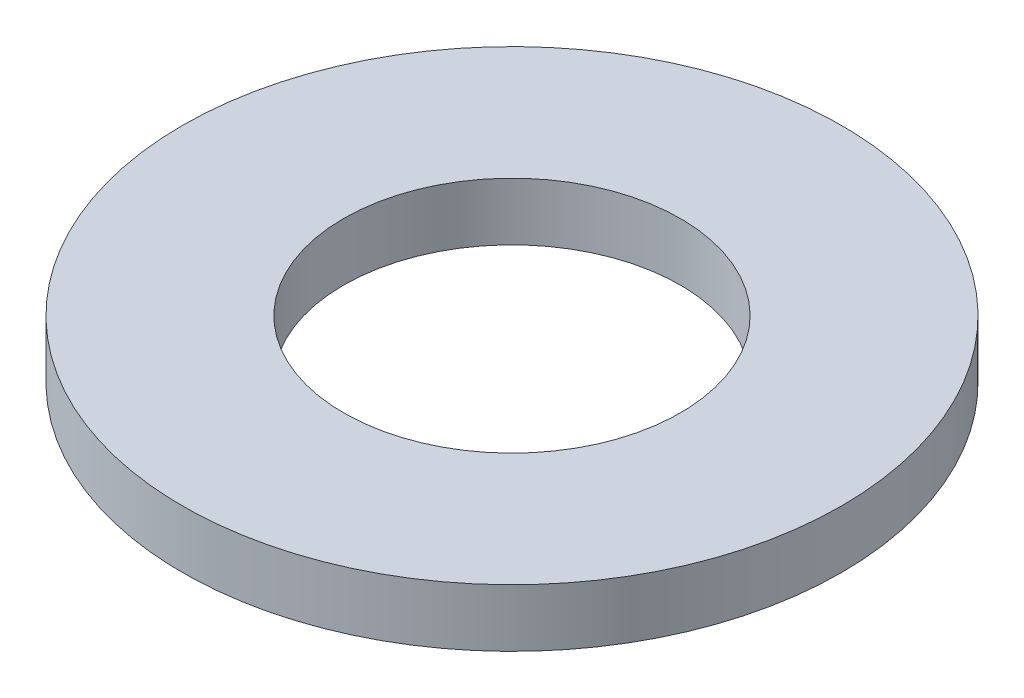
ISO-10303-21;
HEADER;
FILE_DESCRIPTION(('STEP AP214'),'2;1');
FILE_NAME('part.step','',(''),(''),'','','');
FILE_SCHEMA(('AUTOMOTIVE_DESIGN { 1 0 10303 214 1 1 1 1 }'));
ENDSEC;
DATA;
#1=APPLICATION_CONTEXT('core data for automotive mechanical design processes');
#2=APPLICATION_PROTOCOL_DEFINITION('international standard','automotive_design',2000,#1);
#3=PRODUCT_CONTEXT('',#1,'mechanical');
#4=PRODUCT('Part','Part','',(#3));
#5=PRODUCT_RELATED_PRODUCT_CATEGORY('part','',(#4));
#6=PRODUCT_DEFINITION_FORMATION('','',#4);
#7=PRODUCT_DEFINITION_CONTEXT('part definition',#1,'design');
#8=PRODUCT_DEFINITION('design','',#6,#7);
#9=PRODUCT_DEFINITION_SHAPE('','',#8);
#10=(LENGTH_UNIT() NAMED_UNIT(*) SI_UNIT(.MILLI.,.METRE.));
#11=(NAMED_UNIT(*) PLANE_ANGLE_UNIT() SI_UNIT($,.RADIAN.));
#12=(NAMED_UNIT(*) SI_UNIT($,.STERADIAN.) SOLID_ANGLE_UNIT());
#13=UNCERTAINTY_MEASURE_WITH_UNIT(LENGTH_MEASURE(1.E-05),#10,'distance_accuracy_value','');
#14=(GEOMETRIC_REPRESENTATION_CONTEXT(3) GLOBAL_UNCERTAINTY_ASSIGNED_CONTEXT((#13)) GLOBAL_UNIT_ASSIGNED_CONTEXT((#10,
#11,#12)) REPRESENTATION_CONTEXT('',''));
#15=CARTESIAN_POINT('',(0.,0.,0.));
#16=DIRECTION('',(0.,0.,1.));
#17=DIRECTION('',(1.,0.,0.));
#18=AXIS2_PLACEMENT_3D('',#15,#16,#17);
#19=CARTESIAN_POINT('',(3.4250000000245,0.3,0.));
#20=DIRECTION('',(0.,-1.,0.));
#21=DIRECTION('',(1.,0.,0.));
#22=AXIS2_PLACEMENT_3D('',#19,#20,#21);
#23=PLANE('',#22);
#24=CARTESIAN_POINT('',(0.,0.300000000000002,0.));
#25=DIRECTION('',(0.,1.,0.));
#26=DIRECTION('',(-1.,0.,0.));
#27=AXIS2_PLACEMENT_3D('',#24,#25,#26);
#28=CIRCLE('',#27,1.75);
#29=CARTESIAN_POINT('',(-1.74999999999999,0.300000000000001,0.));
#30=VERTEX_POINT('',#29);
#31=EDGE_CURVE('E10',#30,#30,#28,.T.);
#32=ORIENTED_EDGE('',*,*,#31,.F.);
#33=EDGE_LOOP('',(#32));
#34=FACE_BOUND('',#33,.T.);
#35=CARTESIAN_POINT('',(0.,0.300000000000002,0.));
#36=DIRECTION('',(0.,1.,0.));
#37=DIRECTION('',(-1.,0.,0.));
#38=AXIS2_PLACEMENT_3D('',#35,#36,#37);
#39=CIRCLE('',#38,3.42500000002449);
#40=CARTESIAN_POINT('',(-3.42500000002449,0.300000000000001,0.));
#41=VERTEX_POINT('',#40);
#42=EDGE_CURVE('E45',#41,#41,#39,.T.);
#43=ORIENTED_EDGE('',*,*,#42,.T.);
#44=EDGE_LOOP('',(#43));
#45=FACE_BOUND('',#44,.T.);
#46=ADVANCED_FACE('F31',(#34,#45),#23,.F.);
#47=CARTESIAN_POINT('',(0.,35.4173033707865,0.));
#48=DIRECTION('',(0.,1.,0.));
#49=DIRECTION('',(-1.,0.,0.));
#50=AXIS2_PLACEMENT_3D('',#47,#48,#49);
#51=CYLINDRICAL_SURFACE('',#50,1.75);
#52=CARTESIAN_POINT('',(0.,-0.300000000000002,0.));
#53=DIRECTION('',(0.,1.,0.));
#54=DIRECTION('',(-1.,0.,0.));
#55=AXIS2_PLACEMENT_3D('',#52,#53,#54);
#56=CIRCLE('',#55,1.75);
#57=CARTESIAN_POINT('',(-1.74999999999999,-0.300000000000002,0.));
#58=VERTEX_POINT('',#57);
#59=EDGE_CURVE('E37',#58,#58,#56,.T.);
#60=ORIENTED_EDGE('',*,*,#59,.F.);
#61=EDGE_LOOP('',(#60));
#62=FACE_BOUND('',#61,.T.);
#63=ORIENTED_EDGE('',*,*,#31,.T.);
#64=EDGE_LOOP('',(#63));
#65=FACE_BOUND('',#64,.T.);
#66=ADVANCED_FACE('F60',(#62,#65),#51,.F.);
#67=CARTESIAN_POINT('',(1.75,-0.3,0.));
#68=DIRECTION('',(0.,1.,0.));
#69=DIRECTION('',(-1.,0.,0.));
#70=AXIS2_PLACEMENT_3D('',#67,#68,#69);
#71=PLANE('',#70);
#72=CARTESIAN_POINT('',(0.,-0.300000000000002,0.));
#73=DIRECTION('',(0.,1.,0.));
#74=DIRECTION('',(-1.,0.,0.));
#75=AXIS2_PLACEMENT_3D('',#72,#73,#74);
#76=CIRCLE('',#75,3.42500000002449);
#77=CARTESIAN_POINT('',(-3.42500000002449,-0.300000000000002,0.));
#78=VERTEX_POINT('',#77);
#79=EDGE_CURVE('E41',#78,#78,#76,.T.);
#80=ORIENTED_EDGE('',*,*,#79,.F.);
#81=EDGE_LOOP('',(#80));
#82=FACE_BOUND('',#81,.T.);
#83=ORIENTED_EDGE('',*,*,#59,.T.);
#84=EDGE_LOOP('',(#83));
#85=FACE_BOUND('',#84,.T.);
#86=ADVANCED_FACE('F55',(#82,#85),#71,.F.);
#87=CARTESIAN_POINT('',(0.,35.4173033707865,0.));
#88=DIRECTION('',(0.,1.,0.));
#89=DIRECTION('',(-1.,0.,0.));
#90=AXIS2_PLACEMENT_3D('',#87,#88,#89);
#91=CYLINDRICAL_SURFACE('',#90,3.42500000002449);
#92=ORIENTED_EDGE('',*,*,#42,.F.);
#93=EDGE_LOOP('',(#92));
#94=FACE_BOUND('',#93,.T.);
#95=ORIENTED_EDGE('',*,*,#79,.T.);
#96=EDGE_LOOP('',(#95));
#97=FACE_BOUND('',#96,.T.);
#98=ADVANCED_FACE('F52',(#94,#97),#91,.T.);
#99=CLOSED_SHELL('',(#46,#66,#86,#98));
#100=MANIFOLD_SOLID_BREP('B2',#99);
#101=ADVANCED_BREP_SHAPE_REPRESENTATION('',(#18,#100),#14);
#102=SHAPE_DEFINITION_REPRESENTATION(#9,#101);
ENDSEC;
END-ISO-10303-21;
